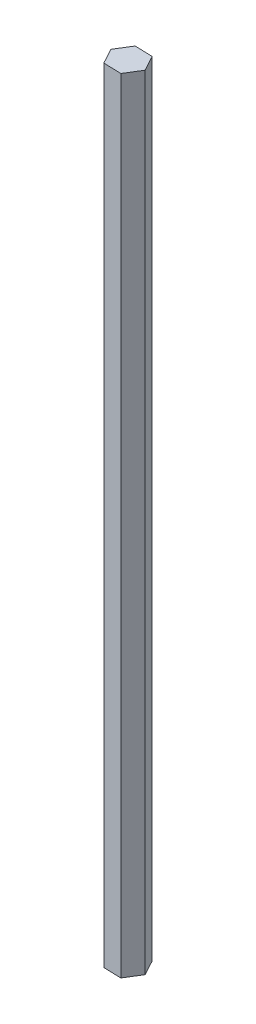
ISO-10303-21;
HEADER;
FILE_DESCRIPTION(('STEP AP214'),'2;1');
FILE_NAME('part.step','',(''),(''),'','','');
FILE_SCHEMA(('AUTOMOTIVE_DESIGN { 1 0 10303 214 1 1 1 1 }'));
ENDSEC;
DATA;
#1=APPLICATION_CONTEXT('core data for automotive mechanical design processes');
#2=APPLICATION_PROTOCOL_DEFINITION('international standard','automotive_design',2000,#1);
#3=PRODUCT_CONTEXT('',#1,'mechanical');
#4=PRODUCT('Part','Part','',(#3));
#5=PRODUCT_RELATED_PRODUCT_CATEGORY('part','',(#4));
#6=PRODUCT_DEFINITION_FORMATION('','',#4);
#7=PRODUCT_DEFINITION_CONTEXT('part definition',#1,'design');
#8=PRODUCT_DEFINITION('design','',#6,#7);
#9=PRODUCT_DEFINITION_SHAPE('','',#8);
#10=(LENGTH_UNIT() NAMED_UNIT(*) SI_UNIT(.MILLI.,.METRE.));
#11=(NAMED_UNIT(*) PLANE_ANGLE_UNIT() SI_UNIT($,.RADIAN.));
#12=(NAMED_UNIT(*) SI_UNIT($,.STERADIAN.) SOLID_ANGLE_UNIT());
#13=UNCERTAINTY_MEASURE_WITH_UNIT(LENGTH_MEASURE(1.E-05),#10,'distance_accuracy_value','');
#14=(GEOMETRIC_REPRESENTATION_CONTEXT(3) GLOBAL_UNCERTAINTY_ASSIGNED_CONTEXT((#13)) GLOBAL_UNIT_ASSIGNED_CONTEXT((#10,
#11,#12)) REPRESENTATION_CONTEXT('',''));
#15=CARTESIAN_POINT('',(0.,0.,0.));
#16=DIRECTION('',(0.,0.,1.));
#17=DIRECTION('',(1.,0.,0.));
#18=AXIS2_PLACEMENT_3D('',#15,#16,#17);
#19=CARTESIAN_POINT('',(-2.06294809419848,175.,3.34029616860183));
#20=DIRECTION('',(0.0296530592830452,0.,-0.99956025134814));
#21=DIRECTION('',(-0.99956025134814,0.,-0.0296530592830452));
#22=AXIS2_PLACEMENT_3D('',#19,#20,#21);
#23=PLANE('',#22);
#24=DIRECTION('',(0.99956025134814,0.,0.0296530592830452));
#25=VECTOR('',#24,1.);
#26=CARTESIAN_POINT('',(-2.06294809419848,0.,3.34029616860183));
#27=LINE('',#26,#25);
#28=CARTESIAN_POINT('',(-2.06294809419848,0.,3.34029616860183));
#29=VERTEX_POINT('',#28);
#30=CARTESIAN_POINT('',(1.86130729107378,0.,3.4567135405655));
#31=VERTEX_POINT('',#30);
#32=EDGE_CURVE('E121',#29,#31,#27,.T.);
#33=ORIENTED_EDGE('',*,*,#32,.T.);
#34=DIRECTION('',(0.,-1.,0.));
#35=VECTOR('',#34,1.);
#36=CARTESIAN_POINT('',(1.86130729107378,175.,3.4567135405655));
#37=LINE('',#36,#35);
#38=CARTESIAN_POINT('',(1.86130729107378,175.,3.4567135405655));
#39=VERTEX_POINT('',#38);
#40=EDGE_CURVE('E11',#39,#31,#37,.T.);
#41=ORIENTED_EDGE('',*,*,#40,.F.);
#42=DIRECTION('',(0.99956025134814,0.,0.0296530592830452));
#43=VECTOR('',#42,1.);
#44=CARTESIAN_POINT('',(-2.06294809419848,175.,3.34029616860183));
#45=LINE('',#44,#43);
#46=CARTESIAN_POINT('',(-2.06294809419848,175.,3.34029616860183));
#47=VERTEX_POINT('',#46);
#48=EDGE_CURVE('E131',#47,#39,#45,.T.);
#49=ORIENTED_EDGE('',*,*,#48,.F.);
#50=DIRECTION('',(0.,-1.,0.));
#51=VECTOR('',#50,1.);
#52=CARTESIAN_POINT('',(-2.06294809419848,175.,3.34029616860183));
#53=LINE('',#52,#51);
#54=EDGE_CURVE('E117',#47,#29,#53,.T.);
#55=ORIENTED_EDGE('',*,*,#54,.T.);
#56=EDGE_LOOP('',(#33,#41,#49,#55));
#57=FACE_BOUND('',#56,.T.);
#58=ADVANCED_FACE('F37',(#57),#23,.F.);
#59=CARTESIAN_POINT('',(1.86130729107378,175.,3.4567135405655));
#60=DIRECTION('',(-0.850818040639125,0.,-0.525460428313113));
#61=DIRECTION('',(-0.525460428313113,0.,0.850818040639125));
#62=AXIS2_PLACEMENT_3D('',#59,#60,#61);
#63=PLANE('',#62);
#64=DIRECTION('',(0.525460428313113,0.,-0.850818040639125));
#65=VECTOR('',#64,1.);
#66=CARTESIAN_POINT('',(1.86130729107378,0.,3.4567135405655));
#67=LINE('',#66,#65);
#68=CARTESIAN_POINT('',(3.92425538527228,0.,0.116417371963645));
#69=VERTEX_POINT('',#68);
#70=EDGE_CURVE('E124',#31,#69,#67,.T.);
#71=ORIENTED_EDGE('',*,*,#70,.T.);
#72=DIRECTION('',(0.,-1.,0.));
#73=VECTOR('',#72,1.);
#74=CARTESIAN_POINT('',(3.92425538527228,175.,0.116417371963645));
#75=LINE('',#74,#73);
#76=CARTESIAN_POINT('',(3.92425538527228,175.,0.116417371963645));
#77=VERTEX_POINT('',#76);
#78=EDGE_CURVE('E45',#77,#69,#75,.T.);
#79=ORIENTED_EDGE('',*,*,#78,.F.);
#80=DIRECTION('',(0.525460428313113,0.,-0.850818040639125));
#81=VECTOR('',#80,1.);
#82=CARTESIAN_POINT('',(1.86130729107378,175.,3.4567135405655));
#83=LINE('',#82,#81);
#84=EDGE_CURVE('E90',#39,#77,#83,.T.);
#85=ORIENTED_EDGE('',*,*,#84,.F.);
#86=ORIENTED_EDGE('',*,*,#40,.T.);
#87=EDGE_LOOP('',(#71,#79,#85,#86));
#88=FACE_BOUND('',#87,.T.);
#89=ADVANCED_FACE('F155',(#88),#63,.F.);
#90=CARTESIAN_POINT('',(3.92425538527228,175.,0.116417371963645));
#91=DIRECTION('',(-0.88047109992217,0.,0.474099823035027));
#92=DIRECTION('',(0.474099823035028,0.,0.88047109992217));
#93=AXIS2_PLACEMENT_3D('',#90,#91,#92);
#94=PLANE('',#93);
#95=DIRECTION('',(-0.474099823035027,0.,-0.88047109992217));
#96=VECTOR('',#95,1.);
#97=CARTESIAN_POINT('',(3.92425538527228,0.,0.116417371963645));
#98=LINE('',#97,#96);
#99=CARTESIAN_POINT('',(2.06294809419849,0.,-3.34029616860186));
#100=VERTEX_POINT('',#99);
#101=EDGE_CURVE('E126',#69,#100,#98,.T.);
#102=ORIENTED_EDGE('',*,*,#101,.T.);
#103=DIRECTION('',(0.,-1.,0.));
#104=VECTOR('',#103,1.);
#105=CARTESIAN_POINT('',(2.06294809419849,175.,-3.34029616860186));
#106=LINE('',#105,#104);
#107=CARTESIAN_POINT('',(2.06294809419849,175.,-3.34029616860186));
#108=VERTEX_POINT('',#107);
#109=EDGE_CURVE('E112',#108,#100,#106,.T.);
#110=ORIENTED_EDGE('',*,*,#109,.F.);
#111=DIRECTION('',(-0.474099823035027,0.,-0.88047109992217));
#112=VECTOR('',#111,1.);
#113=CARTESIAN_POINT('',(3.92425538527228,175.,0.116417371963645));
#114=LINE('',#113,#112);
#115=EDGE_CURVE('E103',#77,#108,#114,.T.);
#116=ORIENTED_EDGE('',*,*,#115,.F.);
#117=ORIENTED_EDGE('',*,*,#78,.T.);
#118=EDGE_LOOP('',(#102,#110,#116,#117));
#119=FACE_BOUND('',#118,.T.);
#120=ADVANCED_FACE('F137',(#119),#94,.F.);
#121=CARTESIAN_POINT('',(2.06294809419849,175.,-3.34029616860186));
#122=DIRECTION('',(-0.0296530592830452,0.,0.99956025134814));
#123=DIRECTION('',(0.99956025134814,0.,0.0296530592830452));
#124=AXIS2_PLACEMENT_3D('',#121,#122,#123);
#125=PLANE('',#124);
#126=DIRECTION('',(-0.99956025134814,0.,-0.0296530592830452));
#127=VECTOR('',#126,1.);
#128=CARTESIAN_POINT('',(2.06294809419849,0.,-3.34029616860186));
#129=LINE('',#128,#127);
#130=CARTESIAN_POINT('',(-1.86130729107377,0.,-3.45671354056552));
#131=VERTEX_POINT('',#130);
#132=EDGE_CURVE('E111',#100,#131,#129,.T.);
#133=ORIENTED_EDGE('',*,*,#132,.T.);
#134=DIRECTION('',(0.,-1.,0.));
#135=VECTOR('',#134,1.);
#136=CARTESIAN_POINT('',(-1.86130729107377,175.,-3.45671354056552));
#137=LINE('',#136,#135);
#138=CARTESIAN_POINT('',(-1.86130729107377,175.,-3.45671354056552));
#139=VERTEX_POINT('',#138);
#140=EDGE_CURVE('E108',#139,#131,#137,.T.);
#141=ORIENTED_EDGE('',*,*,#140,.F.);
#142=DIRECTION('',(-0.99956025134814,0.,-0.0296530592830452));
#143=VECTOR('',#142,1.);
#144=CARTESIAN_POINT('',(2.06294809419849,175.,-3.34029616860186));
#145=LINE('',#144,#143);
#146=EDGE_CURVE('E97',#108,#139,#145,.T.);
#147=ORIENTED_EDGE('',*,*,#146,.F.);
#148=ORIENTED_EDGE('',*,*,#109,.T.);
#149=EDGE_LOOP('',(#133,#141,#147,#148));
#150=FACE_BOUND('',#149,.T.);
#151=ADVANCED_FACE('F109',(#150),#125,.F.);
#152=CARTESIAN_POINT('',(-1.86130729107377,175.,-3.45671354056552));
#153=DIRECTION('',(0.850818040639125,0.,0.525460428313113));
#154=DIRECTION('',(0.525460428313113,0.,-0.850818040639125));
#155=AXIS2_PLACEMENT_3D('',#152,#153,#154);
#156=PLANE('',#155);
#157=DIRECTION('',(-0.525460428313113,0.,0.850818040639125));
#158=VECTOR('',#157,1.);
#159=CARTESIAN_POINT('',(-1.86130729107377,0.,-3.45671354056552));
#160=LINE('',#159,#158);
#161=CARTESIAN_POINT('',(-3.92425538527226,0.,-0.116417371963674));
#162=VERTEX_POINT('',#161);
#163=EDGE_CURVE('E76',#131,#162,#160,.T.);
#164=ORIENTED_EDGE('',*,*,#163,.T.);
#165=DIRECTION('',(0.,-1.,0.));
#166=VECTOR('',#165,1.);
#167=CARTESIAN_POINT('',(-3.92425538527226,175.,-0.116417371963674));
#168=LINE('',#167,#166);
#169=CARTESIAN_POINT('',(-3.92425538527226,175.,-0.116417371963674));
#170=VERTEX_POINT('',#169);
#171=EDGE_CURVE('E113',#170,#162,#168,.T.);
#172=ORIENTED_EDGE('',*,*,#171,.F.);
#173=DIRECTION('',(-0.525460428313113,0.,0.850818040639125));
#174=VECTOR('',#173,1.);
#175=CARTESIAN_POINT('',(-1.86130729107377,175.,-3.45671354056552));
#176=LINE('',#175,#174);
#177=EDGE_CURVE('E101',#139,#170,#176,.T.);
#178=ORIENTED_EDGE('',*,*,#177,.F.);
#179=ORIENTED_EDGE('',*,*,#140,.T.);
#180=EDGE_LOOP('',(#164,#172,#178,#179));
#181=FACE_BOUND('',#180,.T.);
#182=ADVANCED_FACE('F115',(#181),#156,.F.);
#183=CARTESIAN_POINT('',(-3.92425538527226,175.,-0.116417371963674));
#184=DIRECTION('',(0.88047109992217,0.,-0.474099823035027));
#185=DIRECTION('',(-0.474099823035027,0.,-0.880471099922171));
#186=AXIS2_PLACEMENT_3D('',#183,#184,#185);
#187=PLANE('',#186);
#188=DIRECTION('',(0.474099823035027,0.,0.88047109992217));
#189=VECTOR('',#188,1.);
#190=CARTESIAN_POINT('',(-3.92425538527226,0.,-0.116417371963674));
#191=LINE('',#190,#189);
#192=EDGE_CURVE('E82',#162,#29,#191,.T.);
#193=ORIENTED_EDGE('',*,*,#192,.T.);
#194=ORIENTED_EDGE('',*,*,#54,.F.);
#195=DIRECTION('',(0.474099823035027,0.,0.88047109992217));
#196=VECTOR('',#195,1.);
#197=CARTESIAN_POINT('',(-3.92425538527226,175.,-0.116417371963674));
#198=LINE('',#197,#196);
#199=EDGE_CURVE('E53',#170,#47,#198,.T.);
#200=ORIENTED_EDGE('',*,*,#199,.F.);
#201=ORIENTED_EDGE('',*,*,#171,.T.);
#202=EDGE_LOOP('',(#193,#194,#200,#201));
#203=FACE_BOUND('',#202,.T.);
#204=ADVANCED_FACE('F144',(#203),#187,.F.);
#205=CARTESIAN_POINT('',(0.,175.,0.));
#206=DIRECTION('',(0.,1.,0.));
#207=DIRECTION('',(0.,0.,1.));
#208=AXIS2_PLACEMENT_3D('',#205,#206,#207);
#209=PLANE('',#208);
#210=ORIENTED_EDGE('',*,*,#48,.T.);
#211=ORIENTED_EDGE('',*,*,#84,.T.);
#212=ORIENTED_EDGE('',*,*,#115,.T.);
#213=ORIENTED_EDGE('',*,*,#146,.T.);
#214=ORIENTED_EDGE('',*,*,#177,.T.);
#215=ORIENTED_EDGE('',*,*,#199,.T.);
#216=EDGE_LOOP('',(#210,#211,#212,#213,#214,#215));
#217=FACE_BOUND('',#216,.T.);
#218=ADVANCED_FACE('F99',(#217),#209,.T.);
#219=CARTESIAN_POINT('',(0.,0.,0.));
#220=DIRECTION('',(0.,1.,0.));
#221=DIRECTION('',(0.,0.,1.));
#222=AXIS2_PLACEMENT_3D('',#219,#220,#221);
#223=PLANE('',#222);
#224=ORIENTED_EDGE('',*,*,#32,.F.);
#225=ORIENTED_EDGE('',*,*,#192,.F.);
#226=ORIENTED_EDGE('',*,*,#163,.F.);
#227=ORIENTED_EDGE('',*,*,#132,.F.);
#228=ORIENTED_EDGE('',*,*,#101,.F.);
#229=ORIENTED_EDGE('',*,*,#70,.F.);
#230=EDGE_LOOP('',(#224,#225,#226,#227,#228,#229));
#231=FACE_BOUND('',#230,.T.);
#232=ADVANCED_FACE('F140',(#231),#223,.F.);
#233=CLOSED_SHELL('',(#58,#89,#120,#151,#182,#204,#218,#232));
#234=MANIFOLD_SOLID_BREP('B2',#233);
#235=ADVANCED_BREP_SHAPE_REPRESENTATION('',(#18,#234),#14);
#236=SHAPE_DEFINITION_REPRESENTATION(#9,#235);
ENDSEC;
END-ISO-10303-21;
